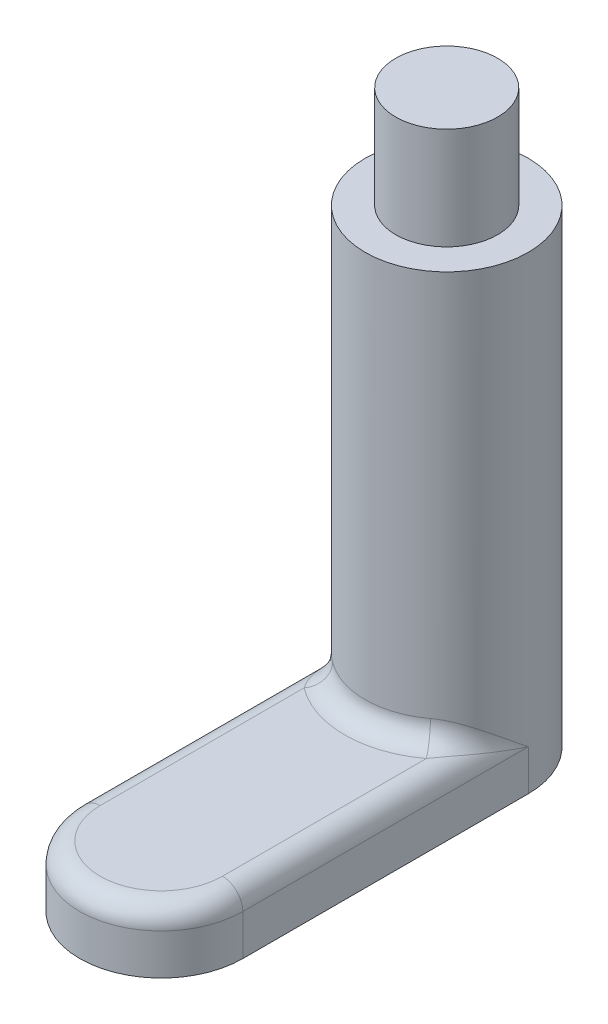
ISO-10303-21;
HEADER;
FILE_DESCRIPTION(('STEP AP214'),'2;1');
FILE_NAME('part.step','',(''),(''),'','','');
FILE_SCHEMA(('AUTOMOTIVE_DESIGN { 1 0 10303 214 1 1 1 1 }'));
ENDSEC;
DATA;
#1=APPLICATION_CONTEXT('core data for automotive mechanical design processes');
#2=APPLICATION_PROTOCOL_DEFINITION('international standard','automotive_design',2000,#1);
#3=PRODUCT_CONTEXT('',#1,'mechanical');
#4=PRODUCT('Part','Part','',(#3));
#5=PRODUCT_RELATED_PRODUCT_CATEGORY('part','',(#4));
#6=PRODUCT_DEFINITION_FORMATION('','',#4);
#7=PRODUCT_DEFINITION_CONTEXT('part definition',#1,'design');
#8=PRODUCT_DEFINITION('design','',#6,#7);
#9=PRODUCT_DEFINITION_SHAPE('','',#8);
#10=(LENGTH_UNIT() NAMED_UNIT(*) SI_UNIT(.MILLI.,.METRE.));
#11=(NAMED_UNIT(*) PLANE_ANGLE_UNIT() SI_UNIT($,.RADIAN.));
#12=(NAMED_UNIT(*) SI_UNIT($,.STERADIAN.) SOLID_ANGLE_UNIT());
#13=UNCERTAINTY_MEASURE_WITH_UNIT(LENGTH_MEASURE(1.E-05),#10,'distance_accuracy_value','');
#14=(GEOMETRIC_REPRESENTATION_CONTEXT(3) GLOBAL_UNCERTAINTY_ASSIGNED_CONTEXT((#13)) GLOBAL_UNIT_ASSIGNED_CONTEXT((#10,
#11,#12)) REPRESENTATION_CONTEXT('',''));
#15=CARTESIAN_POINT('',(0.,0.,0.));
#16=DIRECTION('',(0.,0.,1.));
#17=DIRECTION('',(1.,0.,0.));
#18=AXIS2_PLACEMENT_3D('',#15,#16,#17);
#19=CARTESIAN_POINT('',(0.,7.62,0.));
#20=DIRECTION('',(0.,-1.,0.));
#21=DIRECTION('',(0.,0.,-1.));
#22=AXIS2_PLACEMENT_3D('',#19,#20,#21);
#23=CYLINDRICAL_SURFACE('',#22,10.16);
#24=DIRECTION('',(0.,-1.,0.));
#25=VECTOR('',#24,1.);
#26=CARTESIAN_POINT('',(10.16,7.62,0.));
#27=LINE('',#26,#25);
#28=CARTESIAN_POINT('',(10.16,5.08,0.));
#29=VERTEX_POINT('',#28);
#30=CARTESIAN_POINT('',(10.16,0.,0.));
#31=VERTEX_POINT('',#30);
#32=EDGE_CURVE('E116',#29,#31,#27,.T.);
#33=ORIENTED_EDGE('',*,*,#32,.F.);
#34=CARTESIAN_POINT('',(0.,5.08,0.));
#35=DIRECTION('',(0.,1.,0.));
#36=DIRECTION('',(0.,0.,1.));
#37=AXIS2_PLACEMENT_3D('',#34,#35,#36);
#38=CIRCLE('',#37,10.16);
#39=CARTESIAN_POINT('',(-10.16,5.08,0.));
#40=VERTEX_POINT('',#39);
#41=EDGE_CURVE('E162',#29,#40,#38,.F.);
#42=ORIENTED_EDGE('',*,*,#41,.T.);
#43=DIRECTION('',(0.,-1.,0.));
#44=VECTOR('',#43,1.);
#45=CARTESIAN_POINT('',(-10.16,7.62,0.));
#46=LINE('',#45,#44);
#47=CARTESIAN_POINT('',(-10.16,0.,0.));
#48=VERTEX_POINT('',#47);
#49=EDGE_CURVE('E138',#40,#48,#46,.T.);
#50=ORIENTED_EDGE('',*,*,#49,.T.);
#51=CARTESIAN_POINT('',(0.,0.,0.));
#52=DIRECTION('',(0.,1.,0.));
#53=DIRECTION('',(0.,0.,1.));
#54=AXIS2_PLACEMENT_3D('',#51,#52,#53);
#55=CIRCLE('',#54,10.16);
#56=EDGE_CURVE('E133',#48,#31,#55,.T.);
#57=ORIENTED_EDGE('',*,*,#56,.T.);
#58=EDGE_LOOP('',(#33,#42,#50,#57));
#59=FACE_BOUND('',#58,.T.);
#60=ADVANCED_FACE('F50',(#59),#23,.T.);
#61=CARTESIAN_POINT('',(10.16,7.62,0.));
#62=DIRECTION('',(-1.,0.,0.));
#63=DIRECTION('',(0.,0.,1.));
#64=AXIS2_PLACEMENT_3D('',#61,#62,#63);
#65=PLANE('',#64);
#66=DIRECTION('',(0.,-1.,0.));
#67=VECTOR('',#66,1.);
#68=CARTESIAN_POINT('',(10.16,7.62,-35.56));
#69=LINE('',#68,#67);
#70=CARTESIAN_POINT('',(10.16,5.08,-35.56));
#71=VERTEX_POINT('',#70);
#72=CARTESIAN_POINT('',(10.16,0.,-35.56));
#73=VERTEX_POINT('',#72);
#74=EDGE_CURVE('E127',#71,#73,#69,.T.);
#75=ORIENTED_EDGE('',*,*,#74,.F.);
#76=DIRECTION('',(0.,0.,-1.));
#77=VECTOR('',#76,1.);
#78=CARTESIAN_POINT('',(10.16,5.08,0.));
#79=LINE('',#78,#77);
#80=EDGE_CURVE('E123',#71,#29,#79,.F.);
#81=ORIENTED_EDGE('',*,*,#80,.T.);
#82=ORIENTED_EDGE('',*,*,#32,.T.);
#83=DIRECTION('',(0.,0.,-1.));
#84=VECTOR('',#83,1.);
#85=CARTESIAN_POINT('',(10.16,0.,0.));
#86=LINE('',#85,#84);
#87=EDGE_CURVE('E120',#31,#73,#86,.T.);
#88=ORIENTED_EDGE('',*,*,#87,.T.);
#89=EDGE_LOOP('',(#75,#81,#82,#88));
#90=FACE_BOUND('',#89,.T.);
#91=ADVANCED_FACE('F119',(#90),#65,.F.);
#92=CARTESIAN_POINT('',(0.,7.62,-35.56));
#93=DIRECTION('',(0.,-1.,0.));
#94=DIRECTION('',(0.,0.,-1.));
#95=AXIS2_PLACEMENT_3D('',#92,#93,#94);
#96=CYLINDRICAL_SURFACE('',#95,10.16);
#97=CARTESIAN_POINT('',(0.,0.,-35.56));
#98=DIRECTION('',(0.,1.,0.));
#99=DIRECTION('',(0.,0.,1.));
#100=AXIS2_PLACEMENT_3D('',#97,#98,#99);
#101=CIRCLE('',#100,10.16);
#102=CARTESIAN_POINT('',(-10.16,0.,-35.56));
#103=VERTEX_POINT('',#102);
#104=EDGE_CURVE('E135',#73,#103,#101,.T.);
#105=ORIENTED_EDGE('',*,*,#104,.T.);
#106=DIRECTION('',(0.,-1.,0.));
#107=VECTOR('',#106,1.);
#108=CARTESIAN_POINT('',(-10.16,7.62,-35.56));
#109=LINE('',#108,#107);
#110=CARTESIAN_POINT('',(-10.16,5.08,-35.56));
#111=VERTEX_POINT('',#110);
#112=EDGE_CURVE('E150',#111,#103,#109,.T.);
#113=ORIENTED_EDGE('',*,*,#112,.F.);
#114=CARTESIAN_POINT('',(-6.80566249032221,7.48592070117279,-24.3620526445109));
#115=CARTESIAN_POINT('',(-5.53898139378088,7.05718423898991,-27.0007382562722));
#116=CARTESIAN_POINT('',(-4.79305998451554,9.89184140234559,-26.6016421156087));
#117=CARTESIAN_POINT('',(-6.87498703236082,7.50939373509454,-24.4361998027662));
#118=CARTESIAN_POINT('',(-5.56798611340166,7.10742633204501,-27.0281231781235));
#119=CARTESIAN_POINT('',(-4.90397925161336,9.938787471035,-26.6609598422189));
#120=CARTESIAN_POINT('',(-6.94444634537773,7.52955671140373,-24.513871817848));
#121=CARTESIAN_POINT('',(-5.6014858513196,7.15826854414265,-27.0569986342163));
#122=CARTESIAN_POINT('',(-5.01511415242699,9.97911342370522,-26.7230974542849));
#123=CARTESIAN_POINT('',(-7.08290304546941,7.56358412774397,-24.6757042073797));
#124=CARTESIAN_POINT('',(-5.6775552430657,7.25877239705613,-27.1188281834127));
#125=CARTESIAN_POINT('',(-5.2366448726422,10.0471682560147,-26.8525633659078));
#126=CARTESIAN_POINT('',(-7.15190089807617,7.57745633713468,-24.7598564273378));
#127=CARTESIAN_POINT('',(-5.71993504623946,7.30836382111652,-27.1516731529756));
#128=CARTESIAN_POINT('',(-5.34704143689487,10.0749126743739,-26.9198851418713));
#129=CARTESIAN_POINT('',(-7.28829679763213,7.59918761460054,-24.9335336112412));
#130=CARTESIAN_POINT('',(-5.81344052416578,7.40428300372671,-27.2223340074237));
#131=CARTESIAN_POINT('',(-5.56527487623818,10.1183752290974,-27.0588268889919));
#132=CARTESIAN_POINT('',(-7.3557034525924,7.60709672129527,-25.0230069102403));
#133=CARTESIAN_POINT('',(-5.8642962427977,7.45060211834669,-27.2599818110187));
#134=CARTESIAN_POINT('',(-5.67312552414748,10.1341934426956,-27.1304055281921));
#135=CARTESIAN_POINT('',(-7.48905176092228,7.61750410795693,-25.2074826017848));
#136=CARTESIAN_POINT('',(-5.9742154956817,7.53880149947137,-27.3412914572741));
#137=CARTESIAN_POINT('',(-5.88648281745849,10.1550082160863,-27.2779860814283));
#138=CARTESIAN_POINT('',(-7.55499278683412,7.62000011303243,-25.3024873017218));
#139=CARTESIAN_POINT('',(-6.03310547404325,7.58069842758274,-27.3848257295378));
#140=CARTESIAN_POINT('',(-5.9919884589278,10.160000226096,-27.3539898413776));
#141=CARTESIAN_POINT('',(-7.70611609318739,7.61999985026413,-25.5291766282989));
#142=CARTESIAN_POINT('',(-6.17784522510316,7.67114349766481,-27.4933883120403));
#143=CARTESIAN_POINT('',(-6.23378574910884,10.159999700487,-27.5353413026389));
#144=CARTESIAN_POINT('',(-7.79059346416884,7.61561933177688,-25.6627544736425));
#145=CARTESIAN_POINT('',(-6.26640370146366,7.7178502917263,-27.5608894569492));
#146=CARTESIAN_POINT('',(-6.36894954268194,10.1512386636648,-27.6422035789139));
#147=CARTESIAN_POINT('',(-7.9556207679695,7.59909600748358,-25.9375485717511));
#148=CARTESIAN_POINT('',(-6.45256635970107,7.79899854772922,-27.7078288152395));
#149=CARTESIAN_POINT('',(-6.63299322876124,10.1181920151299,-27.8620388574011));
#150=CARTESIAN_POINT('',(-8.03616780843514,7.5869475752541,-26.0787702931744));
#151=CARTESIAN_POINT('',(-6.54992888692934,7.83365294001639,-27.7869820904585));
#152=CARTESIAN_POINT('',(-6.76186849350171,10.0938951505702,-27.9750162345399));
#153=CARTESIAN_POINT('',(-8.27176465440937,7.5401831650559,-26.5132813769273));
#154=CARTESIAN_POINT('',(-6.84802457518154,7.91677575066634,-28.0401139055899));
#155=CARTESIAN_POINT('',(-7.13882344704397,10.0003663299875,-28.322625101541));
#156=CARTESIAN_POINT('',(-8.42025377892333,7.4952593505888,-26.8166384335035));
#157=CARTESIAN_POINT('',(-7.05960301503998,7.94737469561183,-28.2331104939828));
#158=CARTESIAN_POINT('',(-7.37640604625154,9.91051870108516,-28.5653107467985));
#159=CARTESIAN_POINT('',(-8.65744855645441,7.40089130971313,-27.3510205260054));
#160=CARTESIAN_POINT('',(-7.42158798955174,7.95388466607148,-28.5992022194642));
#161=CARTESIAN_POINT('',(-7.75591769034535,9.72178261949184,-28.9928164208074));
#162=CARTESIAN_POINT('',(-8.75098451612624,7.35655804461932,-27.5774350619691));
#163=CARTESIAN_POINT('',(-7.57067503759864,7.943949828798,-28.759860252423));
#164=CARTESIAN_POINT('',(-7.90557522585898,9.63311608940029,-29.1739480495854));
#165=CARTESIAN_POINT('',(-8.92846888741642,7.25938933891704,-28.0380627279493));
#166=CARTESIAN_POINT('',(-7.86233105386745,7.90039167689388,-29.0978644411628));
#167=CARTESIAN_POINT('',(-8.18955021991727,9.43877867797442,-29.5424501823681));
#168=CARTESIAN_POINT('',(-9.01241347146627,7.20655052417494,-28.272278923503));
#169=CARTESIAN_POINT('',(-8.00527543021146,7.86730256833212,-29.2750654408433));
#170=CARTESIAN_POINT('',(-8.32386155435231,9.33310104837274,-29.7298231388026));
#171=CARTESIAN_POINT('',(-9.170858182391,7.09392674208571,-28.7470413730406));
#172=CARTESIAN_POINT('',(-8.28077542656089,7.78059879495437,-29.6431827314981));
#173=CARTESIAN_POINT('',(-8.5773730918193,9.10785348414853,-30.1096330984323));
#174=CARTESIAN_POINT('',(-9.24534815625577,7.03413443740688,-28.9875941025502));
#175=CARTESIAN_POINT('',(-8.41380810635905,7.72733093820304,-29.834160122401));
#176=CARTESIAN_POINT('',(-8.69655705003517,8.98826887486284,-30.302075282048));
#177=CARTESIAN_POINT('',(-9.38504723797355,6.9089356214062,-29.4736234500566));
#178=CARTESIAN_POINT('',(-8.66687716701654,7.60357486409889,-30.2269663757333));
#179=CARTESIAN_POINT('',(-8.92007558078376,8.73787124287133,-30.690898760052));
#180=CARTESIAN_POINT('',(-9.45025374833556,6.84352754697955,-29.7191014242911));
#181=CARTESIAN_POINT('',(-8.78742066959681,7.53328923631548,-30.4289894457659));
#182=CARTESIAN_POINT('',(-9.02440599733088,8.60705509395588,-30.8872811394304));
#183=CARTESIAN_POINT('',(-9.59693916545493,6.67997096666947,-30.3171150072607));
#184=CARTESIAN_POINT('',(-9.06020500790309,7.34690780414291,-30.9258516552915));
#185=CARTESIAN_POINT('',(-9.25910266473639,8.2799419333435,-31.3656920058121));
#186=CARTESIAN_POINT('',(-9.67387367297341,6.57953846442986,-30.6716300393596));
#187=CARTESIAN_POINT('',(-9.20726170680295,7.22315770200732,-31.2275105115453));
#188=CARTESIAN_POINT('',(-9.38219787685095,8.07907692900003,-31.6493040315184));
#189=CARTESIAN_POINT('',(-9.81035003601109,6.37204981305093,-31.3863181408447));
#190=CARTESIAN_POINT('',(-9.46956685067925,6.95471574940231,-31.8424777133163));
#191=CARTESIAN_POINT('',(-9.60056005772133,7.66409962626129,-32.221054512709));
#192=CARTESIAN_POINT('',(-9.86988401221932,6.26499068975101,-31.7464936958812));
#193=CARTESIAN_POINT('',(-9.58597903552923,6.80981532279238,-32.156930977301));
#194=CARTESIAN_POINT('',(-9.69581441957953,7.4499813795447,-32.5091949567136));
#195=CARTESIAN_POINT('',(-9.97208282920137,6.04635800728952,-32.4703109321634));
#196=CARTESIAN_POINT('',(-9.78614253908064,6.50569990885748,-32.7929452922724));
#197=CARTESIAN_POINT('',(-9.8593325266936,7.01271601453641,-33.0882487457221));
#198=CARTESIAN_POINT('',(-10.0147658978905,5.93478947090243,-32.8339484299263));
#199=CARTESIAN_POINT('',(-9.8708255896592,6.34603530971937,-33.1157915572175));
#200=CARTESIAN_POINT('',(-9.92762543661386,6.78957894179349,-33.3791587439396));
#201=CARTESIAN_POINT('',(-10.0837924377274,5.70872355522918,-33.5635175630361));
#202=CARTESIAN_POINT('',(-10.007627514579,6.01775763563483,-33.7654941276914));
#203=CARTESIAN_POINT('',(-10.0380679003647,6.33744711046982,-33.9628140504322));
#204=CARTESIAN_POINT('',(-10.1101411047527,5.59422711937003,-33.9294484314243));
#205=CARTESIAN_POINT('',(-10.0603658543119,5.84851114419128,-34.0937382407385));
#206=CARTESIAN_POINT('',(-10.0802257675994,6.10845423874308,-34.2555587451403));
#207=CARTESIAN_POINT('',(-10.149199153985,5.34862260145683,-34.7105099184032));
#208=CARTESIAN_POINT('',(-10.1382491685824,5.48346544788867,-34.7944107123959));
#209=CARTESIAN_POINT('',(-10.1427186463816,5.61724520291025,-34.8804079347215));
#210=CARTESIAN_POINT('',(-10.1596816247622,5.21729547784354,-35.1258331346048));
#211=CARTESIAN_POINT('',(-10.1593614367689,5.28595120729109,-35.1692340630975));
#212=CARTESIAN_POINT('',(-10.1594905996444,5.35459095568712,-35.2126665076837));
#213=CARTESIAN_POINT('',(-10.1599976177526,5.08401582634567,-35.547300841625));
#214=CARTESIAN_POINT('',(-10.1599952628227,5.08602374251918,-35.5485707532873));
#215=CARTESIAN_POINT('',(-10.1599961884048,5.08803165269135,-35.5498406733));
#216=CARTESIAN_POINT('',(-10.1599999986226,5.08200790478933,-35.5536504467654));
#217=CARTESIAN_POINT('',(-10.1600000253891,5.08301185823001,-35.554285401658));
#218=CARTESIAN_POINT('',(-10.1599999977965,5.08401580957867,-35.5549203574123));
#219=CARTESIAN_POINT('',(-10.16,5.08,-35.56));
#220=CARTESIAN_POINT('',(-10.16,5.08,-35.56));
#221=CARTESIAN_POINT('',(-10.16,5.08,-35.56));
#222=(BOUNDED_SURFACE() B_SPLINE_SURFACE(3,2,((#114,#115,#116),(#117,#118,#119),(#120,#121,
#122),(#123,#124,#125),(#126,#127,#128),(#129,#130,#131),(#132,#133,#134),(#135,#136,#137),
(#138,#139,#140),(#141,#142,#143),(#144,#145,#146),(#147,#148,#149),(#150,#151,#152),(#153,#154,
#155),(#156,#157,#158),(#159,#160,#161),(#162,#163,#164),(#165,#166,#167),(#168,#169,#170),
(#171,#172,#173),(#174,#175,#176),(#177,#178,#179),(#180,#181,#182),(#183,#184,#185),(#186,#187,
#188),(#189,#190,#191),(#192,#193,#194),(#195,#196,#197),(#198,#199,#200),(#201,#202,#203),
(#204,#205,#206),(#207,#208,#209),(#210,#211,#212),(#213,#214,#215),(#216,#217,#218),(#219,#220,
#221)),.UNSPECIFIED.,.F.,.F.,.F.) B_SPLINE_SURFACE_WITH_KNOTS((4,2,2,2,2,2,2,2,2,2,2,2,2,2,2,2,
2,4),(3,3),(0.,0.491991316891406,0.983373337959708,1.47058463470566,1.95800064554514,
2.60368841719899,3.24984440136862,4.54598871415859,5.46532172201146,6.38502033018898,
7.3056983649325,8.22663349905485,9.53138811046873,10.8367326289402,12.140661239415,
13.4441748647227,14.9176864780284,14.9402253378962),(0.,1.),
.UNSPECIFIED.) GEOMETRIC_REPRESENTATION_ITEM() RATIONAL_B_SPLINE_SURFACE(((1.,0.651441446680811,
1.),(1.,0.655035255066732,1.),(1.,0.658957701492741,1.),(1.,0.667365544942095,1.),(1.,
0.671850238775785,1.),(1.,0.681257501454882,1.),(1.,0.686176030644377,1.),(1.,0.696386037113998,
1.),(1.,0.701677670229303,1.),(1.,0.714298811152912,1.),(1.,0.72173209718842,1.),(1.,
0.736870665516967,1.),(1.,0.74457614113613,1.),(1.,0.76786822546454,1.),(1.,0.783585561318517,
1.),(1.,0.809764036450357,1.),(1.,0.820424868835806,1.),(1.,0.841119029006637,1.),(1.,
0.851152105560004,1.),(1.,0.870419806017391,1.),(1.,0.879653568236328,1.),(1.,0.897203129250384,
1.),(1.,0.905518670984124,1.),(1.,0.924416961273995,1.),(1.,0.934500220234443,1.),(1.,
0.952558371523122,1.),(1.,0.960532308553211,1.),(1.,0.974306485073167,1.),(1.,0.980109072992145,
1.),(1.,0.98952685046428,1.),(1.,0.99314273558582,1.),(1.,0.998509708534984,1.),(1.,
0.999956099031262,1.),(1.,0.999999672202361,1.),(1.,1.00000000028904,1.),(1.,1.,1.))) REPRESENTATION_ITEM('') SURFACE());
#223=CARTESIAN_POINT('',(-4.79305998451554,9.89184140234559,-26.6016421156087));
#224=CARTESIAN_POINT('',(-4.90397925161336,9.938787471035,-26.6609598422189));
#225=CARTESIAN_POINT('',(-5.01511415242699,9.97911342370522,-26.7230974542849));
#226=CARTESIAN_POINT('',(-5.2366448726422,10.0471682560147,-26.8525633659078));
#227=CARTESIAN_POINT('',(-5.34704143689487,10.0749126743739,-26.9198851418713));
#228=CARTESIAN_POINT('',(-5.56527487623818,10.1183752290974,-27.0588268889919));
#229=CARTESIAN_POINT('',(-5.67312552414748,10.1341934426956,-27.1304055281921));
#230=CARTESIAN_POINT('',(-5.88648281745849,10.1550082160863,-27.2779860814283));
#231=CARTESIAN_POINT('',(-5.9919884589278,10.160000226096,-27.3539898413776));
#232=CARTESIAN_POINT('',(-6.23378574910884,10.159999700487,-27.535341302639));
#233=CARTESIAN_POINT('',(-6.36894954268194,10.1512386636648,-27.6422035789139));
#234=CARTESIAN_POINT('',(-6.63299322876124,10.1181920151299,-27.8620388574011));
#235=CARTESIAN_POINT('',(-6.76186849350171,10.0938951505702,-27.9750162345399));
#236=CARTESIAN_POINT('',(-7.13882344704397,10.0003663299875,-28.322625101541));
#237=CARTESIAN_POINT('',(-7.37640604625154,9.91051870108516,-28.5653107467985));
#238=CARTESIAN_POINT('',(-7.75591769034535,9.72178261949184,-28.9928164208074));
#239=CARTESIAN_POINT('',(-7.90557522585898,9.63311608940029,-29.1739480495854));
#240=CARTESIAN_POINT('',(-8.18955021991727,9.43877867797442,-29.5424501823681));
#241=CARTESIAN_POINT('',(-8.32386155435231,9.33310104837273,-29.7298231388026));
#242=CARTESIAN_POINT('',(-8.5773730918193,9.10785348414854,-30.1096330984323));
#243=CARTESIAN_POINT('',(-8.69655705003517,8.98826887486284,-30.302075282048));
#244=CARTESIAN_POINT('',(-8.92007558078376,8.73787124287133,-30.690898760052));
#245=CARTESIAN_POINT('',(-9.02440599733088,8.60705509395588,-30.8872811394304));
#246=CARTESIAN_POINT('',(-9.25910266473639,8.2799419333435,-31.3656920058121));
#247=CARTESIAN_POINT('',(-9.38219787685095,8.07907692900003,-31.6493040315184));
#248=CARTESIAN_POINT('',(-9.60056005772133,7.66409962626129,-32.221054512709));
#249=CARTESIAN_POINT('',(-9.69581441957953,7.4499813795447,-32.5091949567136));
#250=CARTESIAN_POINT('',(-9.8593325266936,7.01271601453641,-33.0882487457221));
#251=CARTESIAN_POINT('',(-9.92762543661386,6.78957894179349,-33.3791587439396));
#252=CARTESIAN_POINT('',(-10.0380679003647,6.33744711046982,-33.9628140504322));
#253=CARTESIAN_POINT('',(-10.0802257675994,6.10845423874308,-34.2555587451403));
#254=CARTESIAN_POINT('',(-10.1427186463816,5.61724520291024,-34.8804079347216));
#255=CARTESIAN_POINT('',(-10.1594905996444,5.35459095568711,-35.2126665076838));
#256=CARTESIAN_POINT('',(-10.1599961884048,5.08803165269136,-35.5498406733));
#257=CARTESIAN_POINT('',(-10.1599999977965,5.08401580957867,-35.5549203574123));
#258=CARTESIAN_POINT('',(-10.16,5.08,-35.56));
#259=B_SPLINE_CURVE_WITH_KNOTS('',3,(#223,#224,#225,#226,#227,#228,#229,#230,#231,#232,#233,
#234,#235,#236,#237,#238,#239,#240,#241,#242,#243,#244,#245,#246,#247,#248,#249,#250,#251,#252,
#253,#254,#255,#256,#257,#258),.UNSPECIFIED.,.F.,.F.,(4,2,2,2,2,2,2,2,2,2,2,2,2,2,2,2,2,4),(0.,
0.491991316891406,0.983373337959708,1.47058463470566,1.95800064554514,2.60368841719899,
3.24984440136862,4.54598871415859,5.46532172201146,6.38502033018898,7.3056983649325,
8.22663349905485,9.53138811046873,10.8367326289402,12.140661239415,13.4441748647227,
14.9176864780284,14.9402253378962),.UNSPECIFIED.);
#260=CARTESIAN_POINT('',(-6.09599999999997,10.16,-27.432));
#261=VERTEX_POINT('',#260);
#262=EDGE_CURVE('E76',#111,#261,#259,.F.);
#263=ORIENTED_EDGE('',*,*,#262,.T.);
#264=CARTESIAN_POINT('',(0.,10.16,-35.56));
#265=DIRECTION('',(0.,1.,0.));
#266=DIRECTION('',(0.,0.,1.));
#267=AXIS2_PLACEMENT_3D('',#264,#265,#266);
#268=CIRCLE('',#267,10.16);
#269=CARTESIAN_POINT('',(6.09599999999997,10.16,-27.432));
#270=VERTEX_POINT('',#269);
#271=EDGE_CURVE('E71',#261,#270,#268,.T.);
#272=ORIENTED_EDGE('',*,*,#271,.T.);
#273=CARTESIAN_POINT('',(4.79305998451554,9.89184140234559,-26.6016421156087));
#274=CARTESIAN_POINT('',(5.53898139378088,7.05718423898991,-27.0007382562722));
#275=CARTESIAN_POINT('',(6.80566249032221,7.48592070117279,-24.3620526445109));
#276=CARTESIAN_POINT('',(4.90397925161336,9.938787471035,-26.6609598422189));
#277=CARTESIAN_POINT('',(5.56798611340166,7.10742633204501,-27.0281231781235));
#278=CARTESIAN_POINT('',(6.87498703236082,7.50939373509454,-24.4361998027662));
#279=CARTESIAN_POINT('',(5.01511415242699,9.97911342370522,-26.7230974542849));
#280=CARTESIAN_POINT('',(5.6014858513196,7.15826854414265,-27.0569986342163));
#281=CARTESIAN_POINT('',(6.94444634537773,7.52955671140373,-24.513871817848));
#282=CARTESIAN_POINT('',(5.2366448726422,10.0471682560147,-26.8525633659078));
#283=CARTESIAN_POINT('',(5.6775552430657,7.25877239705613,-27.1188281834127));
#284=CARTESIAN_POINT('',(7.08290304546941,7.56358412774397,-24.6757042073797));
#285=CARTESIAN_POINT('',(5.34704143689487,10.0749126743739,-26.9198851418713));
#286=CARTESIAN_POINT('',(5.71993504623946,7.30836382111652,-27.1516731529756));
#287=CARTESIAN_POINT('',(7.15190089807617,7.57745633713468,-24.7598564273378));
#288=CARTESIAN_POINT('',(5.56527487623818,10.1183752290974,-27.0588268889919));
#289=CARTESIAN_POINT('',(5.81344052416578,7.40428300372671,-27.2223340074237));
#290=CARTESIAN_POINT('',(7.28829679763213,7.59918761460054,-24.9335336112412));
#291=CARTESIAN_POINT('',(5.67312552414748,10.1341934426956,-27.1304055281921));
#292=CARTESIAN_POINT('',(5.8642962427977,7.45060211834669,-27.2599818110187));
#293=CARTESIAN_POINT('',(7.3557034525924,7.60709672129527,-25.0230069102403));
#294=CARTESIAN_POINT('',(5.88648281745849,10.1550082160863,-27.2779860814283));
#295=CARTESIAN_POINT('',(5.9742154956817,7.53880149947137,-27.3412914572741));
#296=CARTESIAN_POINT('',(7.48905176092228,7.61750410795693,-25.2074826017848));
#297=CARTESIAN_POINT('',(5.9919884589278,10.160000226096,-27.3539898413776));
#298=CARTESIAN_POINT('',(6.03310547404325,7.58069842758274,-27.3848257295378));
#299=CARTESIAN_POINT('',(7.55499278683412,7.62000011303243,-25.3024873017218));
#300=CARTESIAN_POINT('',(6.23378574910884,10.159999700487,-27.5353413026389));
#301=CARTESIAN_POINT('',(6.17784522510316,7.67114349766481,-27.4933883120403));
#302=CARTESIAN_POINT('',(7.70611609318739,7.61999985026413,-25.5291766282989));
#303=CARTESIAN_POINT('',(6.36894954268194,10.1512386636648,-27.6422035789139));
#304=CARTESIAN_POINT('',(6.26640370146366,7.7178502917263,-27.5608894569492));
#305=CARTESIAN_POINT('',(7.79059346416884,7.61561933177688,-25.6627544736425));
#306=CARTESIAN_POINT('',(6.63299322876124,10.1181920151299,-27.8620388574011));
#307=CARTESIAN_POINT('',(6.45256635970107,7.79899854772922,-27.7078288152395));
#308=CARTESIAN_POINT('',(7.9556207679695,7.59909600748358,-25.9375485717511));
#309=CARTESIAN_POINT('',(6.76186849350171,10.0938951505702,-27.9750162345399));
#310=CARTESIAN_POINT('',(6.54992888692934,7.83365294001639,-27.7869820904585));
#311=CARTESIAN_POINT('',(8.03616780843514,7.5869475752541,-26.0787702931744));
#312=CARTESIAN_POINT('',(7.13882344704397,10.0003663299875,-28.322625101541));
#313=CARTESIAN_POINT('',(6.84802457518154,7.91677575066634,-28.0401139055899));
#314=CARTESIAN_POINT('',(8.27176465440937,7.5401831650559,-26.5132813769273));
#315=CARTESIAN_POINT('',(7.37640604625154,9.91051870108516,-28.5653107467985));
#316=CARTESIAN_POINT('',(7.05960301503998,7.94737469561183,-28.2331104939828));
#317=CARTESIAN_POINT('',(8.42025377892333,7.4952593505888,-26.8166384335035));
#318=CARTESIAN_POINT('',(7.75591769034535,9.72178261949184,-28.9928164208074));
#319=CARTESIAN_POINT('',(7.42158798955174,7.95388466607148,-28.5992022194642));
#320=CARTESIAN_POINT('',(8.65744855645441,7.40089130971313,-27.3510205260054));
#321=CARTESIAN_POINT('',(7.90557522585898,9.63311608940029,-29.1739480495854));
#322=CARTESIAN_POINT('',(7.57067503759864,7.943949828798,-28.759860252423));
#323=CARTESIAN_POINT('',(8.75098451612624,7.35655804461932,-27.5774350619691));
#324=CARTESIAN_POINT('',(8.18955021991727,9.43877867797442,-29.5424501823681));
#325=CARTESIAN_POINT('',(7.86233105386745,7.90039167689388,-29.0978644411628));
#326=CARTESIAN_POINT('',(8.92846888741642,7.25938933891704,-28.0380627279493));
#327=CARTESIAN_POINT('',(8.32386155435231,9.33310104837274,-29.7298231388026));
#328=CARTESIAN_POINT('',(8.00527543021146,7.86730256833212,-29.2750654408433));
#329=CARTESIAN_POINT('',(9.01241347146627,7.20655052417494,-28.272278923503));
#330=CARTESIAN_POINT('',(8.5773730918193,9.10785348414853,-30.1096330984323));
#331=CARTESIAN_POINT('',(8.28077542656089,7.78059879495437,-29.6431827314981));
#332=CARTESIAN_POINT('',(9.170858182391,7.09392674208571,-28.7470413730406));
#333=CARTESIAN_POINT('',(8.69655705003517,8.98826887486284,-30.302075282048));
#334=CARTESIAN_POINT('',(8.41380810635905,7.72733093820304,-29.834160122401));
#335=CARTESIAN_POINT('',(9.24534815625577,7.03413443740688,-28.9875941025502));
#336=CARTESIAN_POINT('',(8.92007558078376,8.73787124287133,-30.690898760052));
#337=CARTESIAN_POINT('',(8.66687716701654,7.60357486409889,-30.2269663757333));
#338=CARTESIAN_POINT('',(9.38504723797355,6.9089356214062,-29.4736234500566));
#339=CARTESIAN_POINT('',(9.02440599733088,8.60705509395588,-30.8872811394304));
#340=CARTESIAN_POINT('',(8.78742066959681,7.53328923631548,-30.4289894457659));
#341=CARTESIAN_POINT('',(9.45025374833556,6.84352754697955,-29.7191014242911));
#342=CARTESIAN_POINT('',(9.25910266473639,8.2799419333435,-31.3656920058121));
#343=CARTESIAN_POINT('',(9.06020500790309,7.34690780414291,-30.9258516552915));
#344=CARTESIAN_POINT('',(9.59693916545493,6.67997096666947,-30.3171150072607));
#345=CARTESIAN_POINT('',(9.38219787685095,8.07907692900003,-31.6493040315184));
#346=CARTESIAN_POINT('',(9.20726170680295,7.22315770200732,-31.2275105115453));
#347=CARTESIAN_POINT('',(9.67387367297341,6.57953846442986,-30.6716300393596));
#348=CARTESIAN_POINT('',(9.60056005772133,7.66409962626129,-32.221054512709));
#349=CARTESIAN_POINT('',(9.46956685067925,6.95471574940231,-31.8424777133163));
#350=CARTESIAN_POINT('',(9.81035003601109,6.37204981305093,-31.3863181408447));
#351=CARTESIAN_POINT('',(9.69581441957953,7.4499813795447,-32.5091949567136));
#352=CARTESIAN_POINT('',(9.58597903552923,6.80981532279238,-32.156930977301));
#353=CARTESIAN_POINT('',(9.86988401221932,6.26499068975101,-31.7464936958812));
#354=CARTESIAN_POINT('',(9.8593325266936,7.01271601453641,-33.0882487457221));
#355=CARTESIAN_POINT('',(9.78614253908064,6.50569990885748,-32.7929452922724));
#356=CARTESIAN_POINT('',(9.97208282920137,6.04635800728952,-32.4703109321634));
#357=CARTESIAN_POINT('',(9.92762543661386,6.78957894179349,-33.3791587439396));
#358=CARTESIAN_POINT('',(9.8708255896592,6.34603530971937,-33.1157915572175));
#359=CARTESIAN_POINT('',(10.0147658978905,5.93478947090243,-32.8339484299263));
#360=CARTESIAN_POINT('',(10.0380679003647,6.33744711046982,-33.9628140504322));
#361=CARTESIAN_POINT('',(10.007627514579,6.01775763563483,-33.7654941276914));
#362=CARTESIAN_POINT('',(10.0837924377274,5.70872355522918,-33.5635175630361));
#363=CARTESIAN_POINT('',(10.0802257675994,6.10845423874308,-34.2555587451403));
#364=CARTESIAN_POINT('',(10.0603658543119,5.84851114419128,-34.0937382407385));
#365=CARTESIAN_POINT('',(10.1101411047527,5.59422711937003,-33.9294484314243));
#366=CARTESIAN_POINT('',(10.1427186463816,5.61724520291025,-34.8804079347215));
#367=CARTESIAN_POINT('',(10.1382491685824,5.48346544788867,-34.7944107123959));
#368=CARTESIAN_POINT('',(10.149199153985,5.34862260145683,-34.7105099184032));
#369=CARTESIAN_POINT('',(10.1594905996444,5.35459095568712,-35.2126665076837));
#370=CARTESIAN_POINT('',(10.1593614367689,5.28595120729109,-35.1692340630975));
#371=CARTESIAN_POINT('',(10.1596816247622,5.21729547784354,-35.1258331346048));
#372=CARTESIAN_POINT('',(10.1599961884048,5.08803165269135,-35.5498406733));
#373=CARTESIAN_POINT('',(10.1599952628227,5.08602374251918,-35.5485707532873));
#374=CARTESIAN_POINT('',(10.1599976177526,5.08401582634567,-35.547300841625));
#375=CARTESIAN_POINT('',(10.1599999977965,5.08401580957867,-35.5549203574123));
#376=CARTESIAN_POINT('',(10.1600000253891,5.08301185823001,-35.554285401658));
#377=CARTESIAN_POINT('',(10.1599999986226,5.08200790478933,-35.5536504467654));
#378=CARTESIAN_POINT('',(10.16,5.08,-35.56));
#379=CARTESIAN_POINT('',(10.16,5.08,-35.56));
#380=CARTESIAN_POINT('',(10.16,5.08,-35.56));
#381=(BOUNDED_SURFACE() B_SPLINE_SURFACE(3,2,((#273,#274,#275),(#276,#277,#278),(#279,#280,
#281),(#282,#283,#284),(#285,#286,#287),(#288,#289,#290),(#291,#292,#293),(#294,#295,#296),
(#297,#298,#299),(#300,#301,#302),(#303,#304,#305),(#306,#307,#308),(#309,#310,#311),(#312,#313,
#314),(#315,#316,#317),(#318,#319,#320),(#321,#322,#323),(#324,#325,#326),(#327,#328,#329),
(#330,#331,#332),(#333,#334,#335),(#336,#337,#338),(#339,#340,#341),(#342,#343,#344),(#345,#346,
#347),(#348,#349,#350),(#351,#352,#353),(#354,#355,#356),(#357,#358,#359),(#360,#361,#362),
(#363,#364,#365),(#366,#367,#368),(#369,#370,#371),(#372,#373,#374),(#375,#376,#377),(#378,#379,
#380)),.UNSPECIFIED.,.F.,.F.,.F.) B_SPLINE_SURFACE_WITH_KNOTS((4,2,2,2,2,2,2,2,2,2,2,2,2,2,2,2,
2,4),(3,3),(0.,0.491991316891406,0.983373337959708,1.47058463470566,1.95800064554514,
2.60368841719899,3.24984440136862,4.54598871415859,5.46532172201146,6.38502033018898,
7.3056983649325,8.22663349905485,9.53138811046873,10.8367326289402,12.140661239415,
13.4441748647227,14.9176864780284,14.9402253378962),(0.,1.),
.UNSPECIFIED.) GEOMETRIC_REPRESENTATION_ITEM() RATIONAL_B_SPLINE_SURFACE(((1.,0.651441446680811,
1.),(1.,0.655035255066732,1.),(1.,0.658957701492741,1.),(1.,0.667365544942095,1.),(1.,
0.671850238775785,1.),(1.,0.681257501454882,1.),(1.,0.686176030644377,1.),(1.,0.696386037113998,
1.),(1.,0.701677670229303,1.),(1.,0.714298811152912,1.),(1.,0.72173209718842,1.),(1.,
0.736870665516967,1.),(1.,0.74457614113613,1.),(1.,0.76786822546454,1.),(1.,0.783585561318517,
1.),(1.,0.809764036450357,1.),(1.,0.820424868835806,1.),(1.,0.841119029006637,1.),(1.,
0.851152105560004,1.),(1.,0.870419806017391,1.),(1.,0.879653568236328,1.),(1.,0.897203129250384,
1.),(1.,0.905518670984124,1.),(1.,0.924416961273995,1.),(1.,0.934500220234443,1.),(1.,
0.952558371523122,1.),(1.,0.960532308553211,1.),(1.,0.974306485073167,1.),(1.,0.980109072992145,
1.),(1.,0.98952685046428,1.),(1.,0.99314273558582,1.),(1.,0.998509708534984,1.),(1.,
0.999956099031262,1.),(1.,0.999999672202361,1.),(1.,1.00000000028904,1.),(1.,1.,1.))) REPRESENTATION_ITEM('') SURFACE());
#382=CARTESIAN_POINT('',(4.79305998451554,9.89184140234559,-26.6016421156087));
#383=CARTESIAN_POINT('',(4.90397925161336,9.938787471035,-26.6609598422189));
#384=CARTESIAN_POINT('',(5.01511415242699,9.97911342370522,-26.7230974542849));
#385=CARTESIAN_POINT('',(5.2366448726422,10.0471682560147,-26.8525633659078));
#386=CARTESIAN_POINT('',(5.34704143689487,10.0749126743739,-26.9198851418713));
#387=CARTESIAN_POINT('',(5.56527487623818,10.1183752290974,-27.0588268889919));
#388=CARTESIAN_POINT('',(5.67312552414748,10.1341934426956,-27.1304055281921));
#389=CARTESIAN_POINT('',(5.88648281745849,10.1550082160863,-27.2779860814283));
#390=CARTESIAN_POINT('',(5.9919884589278,10.160000226096,-27.3539898413776));
#391=CARTESIAN_POINT('',(6.23378574910884,10.159999700487,-27.535341302639));
#392=CARTESIAN_POINT('',(6.36894954268194,10.1512386636648,-27.6422035789139));
#393=CARTESIAN_POINT('',(6.63299322876124,10.1181920151299,-27.8620388574011));
#394=CARTESIAN_POINT('',(6.76186849350171,10.0938951505702,-27.9750162345399));
#395=CARTESIAN_POINT('',(7.13882344704397,10.0003663299875,-28.322625101541));
#396=CARTESIAN_POINT('',(7.37640604625154,9.91051870108516,-28.5653107467985));
#397=CARTESIAN_POINT('',(7.75591769034535,9.72178261949184,-28.9928164208074));
#398=CARTESIAN_POINT('',(7.90557522585898,9.63311608940029,-29.1739480495854));
#399=CARTESIAN_POINT('',(8.18955021991727,9.43877867797442,-29.5424501823681));
#400=CARTESIAN_POINT('',(8.32386155435231,9.33310104837273,-29.7298231388026));
#401=CARTESIAN_POINT('',(8.5773730918193,9.10785348414854,-30.1096330984323));
#402=CARTESIAN_POINT('',(8.69655705003517,8.98826887486284,-30.302075282048));
#403=CARTESIAN_POINT('',(8.92007558078376,8.73787124287133,-30.690898760052));
#404=CARTESIAN_POINT('',(9.02440599733088,8.60705509395588,-30.8872811394304));
#405=CARTESIAN_POINT('',(9.25910266473639,8.2799419333435,-31.3656920058121));
#406=CARTESIAN_POINT('',(9.38219787685095,8.07907692900003,-31.6493040315184));
#407=CARTESIAN_POINT('',(9.60056005772133,7.66409962626129,-32.221054512709));
#408=CARTESIAN_POINT('',(9.69581441957953,7.4499813795447,-32.5091949567136));
#409=CARTESIAN_POINT('',(9.8593325266936,7.01271601453641,-33.0882487457221));
#410=CARTESIAN_POINT('',(9.92762543661386,6.78957894179349,-33.3791587439396));
#411=CARTESIAN_POINT('',(10.0380679003647,6.33744711046982,-33.9628140504322));
#412=CARTESIAN_POINT('',(10.0802257675994,6.10845423874308,-34.2555587451403));
#413=CARTESIAN_POINT('',(10.1427186463816,5.61724520291024,-34.8804079347216));
#414=CARTESIAN_POINT('',(10.1594905996444,5.35459095568711,-35.2126665076838));
#415=CARTESIAN_POINT('',(10.1599961884048,5.08803165269136,-35.5498406733));
#416=CARTESIAN_POINT('',(10.1599999977965,5.08401580957867,-35.5549203574123));
#417=CARTESIAN_POINT('',(10.16,5.08,-35.56));
#418=B_SPLINE_CURVE_WITH_KNOTS('',3,(#382,#383,#384,#385,#386,#387,#388,#389,#390,#391,#392,
#393,#394,#395,#396,#397,#398,#399,#400,#401,#402,#403,#404,#405,#406,#407,#408,#409,#410,#411,
#412,#413,#414,#415,#416,#417),.UNSPECIFIED.,.F.,.F.,(4,2,2,2,2,2,2,2,2,2,2,2,2,2,2,2,2,4),(0.,
0.491991316891406,0.983373337959708,1.47058463470566,1.95800064554514,2.60368841719899,
3.24984440136862,4.54598871415859,5.46532172201146,6.38502033018898,7.3056983649325,
8.22663349905485,9.53138811046873,10.8367326289402,12.140661239415,13.4441748647227,
14.9176864780284,14.9402253378962),.UNSPECIFIED.);
#419=EDGE_CURVE('E63',#270,#71,#418,.T.);
#420=ORIENTED_EDGE('',*,*,#419,.T.);
#421=ORIENTED_EDGE('',*,*,#74,.T.);
#422=EDGE_LOOP('',(#105,#113,#263,#272,#420,#421));
#423=FACE_BOUND('',#422,.T.);
#424=CARTESIAN_POINT('',(0.,58.42,-35.56));
#425=DIRECTION('',(0.,1.,0.));
#426=DIRECTION('',(0.,0.,1.));
#427=AXIS2_PLACEMENT_3D('',#424,#425,#426);
#428=CIRCLE('',#427,10.16);
#429=CARTESIAN_POINT('',(0.,58.42,-25.4));
#430=VERTEX_POINT('',#429);
#431=EDGE_CURVE('E140',#430,#430,#428,.T.);
#432=ORIENTED_EDGE('',*,*,#431,.F.);
#433=EDGE_LOOP('',(#432));
#434=FACE_BOUND('',#433,.T.);
#435=ADVANCED_FACE('F183',(#423,#434),#96,.T.);
#436=CARTESIAN_POINT('',(-10.16,7.62,0.));
#437=DIRECTION('',(1.,0.,0.));
#438=DIRECTION('',(0.,0.,-1.));
#439=AXIS2_PLACEMENT_3D('',#436,#437,#438);
#440=PLANE('',#439);
#441=ORIENTED_EDGE('',*,*,#49,.F.);
#442=DIRECTION('',(0.,0.,1.));
#443=VECTOR('',#442,1.);
#444=CARTESIAN_POINT('',(-10.16,5.08,-35.56));
#445=LINE('',#444,#443);
#446=EDGE_CURVE('E164',#40,#111,#445,.F.);
#447=ORIENTED_EDGE('',*,*,#446,.T.);
#448=ORIENTED_EDGE('',*,*,#112,.T.);
#449=DIRECTION('',(0.,0.,1.));
#450=VECTOR('',#449,1.);
#451=CARTESIAN_POINT('',(-10.16,0.,0.));
#452=LINE('',#451,#450);
#453=EDGE_CURVE('E147',#103,#48,#452,.T.);
#454=ORIENTED_EDGE('',*,*,#453,.T.);
#455=EDGE_LOOP('',(#441,#447,#448,#454));
#456=FACE_BOUND('',#455,.T.);
#457=ADVANCED_FACE('F188',(#456),#440,.F.);
#458=CARTESIAN_POINT('',(0.,7.62,0.));
#459=DIRECTION('',(0.,1.,0.));
#460=DIRECTION('',(0.,0.,1.));
#461=AXIS2_PLACEMENT_3D('',#458,#459,#460);
#462=PLANE('',#461);
#463=CARTESIAN_POINT('',(0.,7.62,0.));
#464=DIRECTION('',(0.,1.,0.));
#465=DIRECTION('',(0.,0.,1.));
#466=AXIS2_PLACEMENT_3D('',#463,#464,#465);
#467=CIRCLE('',#466,7.62);
#468=CARTESIAN_POINT('',(-7.62,7.62,0.));
#469=VERTEX_POINT('',#468);
#470=CARTESIAN_POINT('',(7.62,7.62,0.));
#471=VERTEX_POINT('',#470);
#472=EDGE_CURVE('E156',#469,#471,#467,.T.);
#473=ORIENTED_EDGE('',*,*,#472,.T.);
#474=DIRECTION('',(0.,0.,-1.));
#475=VECTOR('',#474,1.);
#476=CARTESIAN_POINT('',(7.62,7.62,-35.56));
#477=LINE('',#476,#475);
#478=CARTESIAN_POINT('',(7.61999999999996,7.62,-25.4));
#479=VERTEX_POINT('',#478);
#480=EDGE_CURVE('E158',#471,#479,#477,.T.);
#481=ORIENTED_EDGE('',*,*,#480,.T.);
#482=CARTESIAN_POINT('',(0.,7.62,-35.56));
#483=DIRECTION('',(0.,1.,0.));
#484=DIRECTION('',(0.,0.,1.));
#485=AXIS2_PLACEMENT_3D('',#482,#483,#484);
#486=CIRCLE('',#485,12.7);
#487=CARTESIAN_POINT('',(-7.61999999999996,7.62,-25.4));
#488=VERTEX_POINT('',#487);
#489=EDGE_CURVE('E126',#479,#488,#486,.F.);
#490=ORIENTED_EDGE('',*,*,#489,.T.);
#491=DIRECTION('',(0.,0.,1.));
#492=VECTOR('',#491,1.);
#493=CARTESIAN_POINT('',(-7.62,7.62,0.));
#494=LINE('',#493,#492);
#495=EDGE_CURVE('E154',#488,#469,#494,.T.);
#496=ORIENTED_EDGE('',*,*,#495,.T.);
#497=EDGE_LOOP('',(#473,#481,#490,#496));
#498=FACE_BOUND('',#497,.T.);
#499=ADVANCED_FACE('F273',(#498),#462,.T.);
#500=CARTESIAN_POINT('',(0.,0.,0.));
#501=DIRECTION('',(0.,1.,0.));
#502=DIRECTION('',(0.,0.,1.));
#503=AXIS2_PLACEMENT_3D('',#500,#501,#502);
#504=PLANE('',#503);
#505=ORIENTED_EDGE('',*,*,#56,.F.);
#506=ORIENTED_EDGE('',*,*,#453,.F.);
#507=ORIENTED_EDGE('',*,*,#104,.F.);
#508=ORIENTED_EDGE('',*,*,#87,.F.);
#509=EDGE_LOOP('',(#505,#506,#507,#508));
#510=FACE_BOUND('',#509,.T.);
#511=ADVANCED_FACE('F131',(#510),#504,.F.);
#512=CARTESIAN_POINT('',(0.,58.42,-35.56));
#513=DIRECTION('',(0.,1.,0.));
#514=DIRECTION('',(0.,0.,1.));
#515=AXIS2_PLACEMENT_3D('',#512,#513,#514);
#516=PLANE('',#515);
#517=CARTESIAN_POINT('',(0.,58.42,-35.56));
#518=DIRECTION('',(0.,1.,0.));
#519=DIRECTION('',(0.,0.,1.));
#520=AXIS2_PLACEMENT_3D('',#517,#518,#519);
#521=CIRCLE('',#520,6.35);
#522=CARTESIAN_POINT('',(0.,58.42,-29.21));
#523=VERTEX_POINT('',#522);
#524=EDGE_CURVE('E13',#523,#523,#521,.T.);
#525=ORIENTED_EDGE('',*,*,#524,.F.);
#526=EDGE_LOOP('',(#525));
#527=FACE_BOUND('',#526,.T.);
#528=ORIENTED_EDGE('',*,*,#431,.T.);
#529=EDGE_LOOP('',(#528));
#530=FACE_BOUND('',#529,.T.);
#531=ADVANCED_FACE('F205',(#527,#530),#516,.T.);
#532=CARTESIAN_POINT('',(-7.61999999999996,10.16,-25.4));
#533=DIRECTION('',(-0.800000000000003,0.,-0.599999999999997));
#534=DIRECTION('',(-0.599999999999997,0.,0.800000000000003));
#535=AXIS2_PLACEMENT_3D('',#532,#533,#534);
#536=CIRCLE('',#535,2.54);
#537=EDGE_CURVE('E223',#261,#488,#536,.T.);
#538=ORIENTED_EDGE('',*,*,#537,.F.);
#539=ORIENTED_EDGE('',*,*,#262,.F.);
#540=CARTESIAN_POINT('',(-6.80566249032221,7.48592070117279,-24.3620526445109));
#541=CARTESIAN_POINT('',(-6.87498703236082,7.50939373509454,-24.4361998027662));
#542=CARTESIAN_POINT('',(-6.94444634537773,7.52955671140373,-24.513871817848));
#543=CARTESIAN_POINT('',(-7.08290304546941,7.56358412774398,-24.6757042073797));
#544=CARTESIAN_POINT('',(-7.15190089807617,7.57745633713468,-24.7598564273378));
#545=CARTESIAN_POINT('',(-7.28829679763213,7.59918761460054,-24.9335336112412));
#546=CARTESIAN_POINT('',(-7.3557034525924,7.60709672129527,-25.0230069102403));
#547=CARTESIAN_POINT('',(-7.48905176092228,7.61750410795693,-25.2074826017848));
#548=CARTESIAN_POINT('',(-7.55499278683413,7.62000011303243,-25.3024873017218));
#549=CARTESIAN_POINT('',(-7.70611609318739,7.61999985026413,-25.5291766282989));
#550=CARTESIAN_POINT('',(-7.79059346416884,7.61561933177688,-25.6627544736425));
#551=CARTESIAN_POINT('',(-7.9556207679695,7.59909600748358,-25.9375485717511));
#552=CARTESIAN_POINT('',(-8.03616780843514,7.5869475752541,-26.0787702931744));
#553=CARTESIAN_POINT('',(-8.27176465440937,7.5401831650559,-26.5132813769273));
#554=CARTESIAN_POINT('',(-8.42025377892333,7.4952593505888,-26.8166384335035));
#555=CARTESIAN_POINT('',(-8.65744855645441,7.40089130971313,-27.3510205260054));
#556=CARTESIAN_POINT('',(-8.75098451612625,7.35655804461932,-27.5774350619691));
#557=CARTESIAN_POINT('',(-8.92846888741642,7.25938933891704,-28.0380627279493));
#558=CARTESIAN_POINT('',(-9.01241347146627,7.20655052417494,-28.272278923503));
#559=CARTESIAN_POINT('',(-9.170858182391,7.09392674208571,-28.7470413730406));
#560=CARTESIAN_POINT('',(-9.24534815625577,7.03413443740688,-28.9875941025502));
#561=CARTESIAN_POINT('',(-9.38504723797355,6.9089356214062,-29.4736234500566));
#562=CARTESIAN_POINT('',(-9.45025374833556,6.84352754697955,-29.7191014242911));
#563=CARTESIAN_POINT('',(-9.59693916545493,6.67997096666947,-30.3171150072607));
#564=CARTESIAN_POINT('',(-9.67387367297341,6.57953846442986,-30.6716300393596));
#565=CARTESIAN_POINT('',(-9.81035003601109,6.37204981305093,-31.3863181408447));
#566=CARTESIAN_POINT('',(-9.86988401221932,6.26499068975101,-31.7464936958812));
#567=CARTESIAN_POINT('',(-9.97208282920137,6.04635800728952,-32.4703109321634));
#568=CARTESIAN_POINT('',(-10.0147658978905,5.93478947090243,-32.8339484299263));
#569=CARTESIAN_POINT('',(-10.0837924377274,5.70872355522918,-33.5635175630361));
#570=CARTESIAN_POINT('',(-10.1101411047527,5.59422711937003,-33.9294484314243));
#571=CARTESIAN_POINT('',(-10.149199153985,5.34862260145683,-34.7105099184032));
#572=CARTESIAN_POINT('',(-10.1596816247622,5.21729547784353,-35.1258331346048));
#573=CARTESIAN_POINT('',(-10.1599976177526,5.08401582634567,-35.547300841625));
#574=CARTESIAN_POINT('',(-10.1599999986226,5.08200790478933,-35.5536504467654));
#575=CARTESIAN_POINT('',(-10.16,5.08,-35.56));
#576=B_SPLINE_CURVE_WITH_KNOTS('',3,(#540,#541,#542,#543,#544,#545,#546,#547,#548,#549,#550,
#551,#552,#553,#554,#555,#556,#557,#558,#559,#560,#561,#562,#563,#564,#565,#566,#567,#568,#569,
#570,#571,#572,#573,#574,#575),.UNSPECIFIED.,.F.,.F.,(4,2,2,2,2,2,2,2,2,2,2,2,2,2,2,2,2,4),(0.,
0.491991316891406,0.983373337959708,1.47058463470566,1.95800064554514,2.60368841719899,
3.24984440136862,4.54598871415859,5.46532172201146,6.38502033018898,7.3056983649325,
8.22663349905485,9.53138811046873,10.8367326289402,12.140661239415,13.4441748647227,
14.9176864780284,14.9402253378962),.UNSPECIFIED.);
#577=EDGE_CURVE('E143',#488,#111,#576,.T.);
#578=ORIENTED_EDGE('',*,*,#577,.F.);
#579=EDGE_LOOP('',(#538,#539,#578));
#580=FACE_BOUND('',#579,.T.);
#581=ADVANCED_FACE('F199',(#580),#222,.F.);
#582=CARTESIAN_POINT('',(-7.62,5.08,0.));
#583=DIRECTION('',(0.,0.,-1.));
#584=DIRECTION('',(-1.,0.,0.));
#585=AXIS2_PLACEMENT_3D('',#582,#583,#584);
#586=CYLINDRICAL_SURFACE('',#585,2.54);
#587=ORIENTED_EDGE('',*,*,#577,.T.);
#588=ORIENTED_EDGE('',*,*,#446,.F.);
#589=CARTESIAN_POINT('',(-7.62,5.08,0.));
#590=DIRECTION('',(0.,0.,1.));
#591=DIRECTION('',(1.,0.,0.));
#592=AXIS2_PLACEMENT_3D('',#589,#590,#591);
#593=CIRCLE('',#592,2.54);
#594=EDGE_CURVE('E226',#469,#40,#593,.T.);
#595=ORIENTED_EDGE('',*,*,#594,.F.);
#596=ORIENTED_EDGE('',*,*,#495,.F.);
#597=EDGE_LOOP('',(#587,#588,#595,#596));
#598=FACE_BOUND('',#597,.T.);
#599=ADVANCED_FACE('F204',(#598),#586,.T.);
#600=CARTESIAN_POINT('',(0.,10.16,-35.56));
#601=DIRECTION('',(0.,1.,0.));
#602=DIRECTION('',(0.,0.,1.));
#603=AXIS2_PLACEMENT_3D('',#600,#601,#602);
#604=TOROIDAL_SURFACE('',#603,12.7,2.54);
#605=ORIENTED_EDGE('',*,*,#537,.T.);
#606=ORIENTED_EDGE('',*,*,#489,.F.);
#607=CARTESIAN_POINT('',(7.61999999999996,10.16,-25.4));
#608=DIRECTION('',(-0.800000000000002,0.,0.599999999999997));
#609=DIRECTION('',(0.599999999999997,0.,0.800000000000002));
#610=AXIS2_PLACEMENT_3D('',#607,#608,#609);
#611=CIRCLE('',#610,2.54);
#612=EDGE_CURVE('E229',#270,#479,#611,.T.);
#613=ORIENTED_EDGE('',*,*,#612,.F.);
#614=ORIENTED_EDGE('',*,*,#271,.F.);
#615=EDGE_LOOP('',(#605,#606,#613,#614));
#616=FACE_BOUND('',#615,.T.);
#617=ADVANCED_FACE('F213',(#616),#604,.F.);
#618=CARTESIAN_POINT('',(0.,5.08,0.));
#619=DIRECTION('',(0.,1.,0.));
#620=DIRECTION('',(0.,0.,1.));
#621=AXIS2_PLACEMENT_3D('',#618,#619,#620);
#622=TOROIDAL_SURFACE('',#621,7.62,2.54);
#623=ORIENTED_EDGE('',*,*,#594,.T.);
#624=ORIENTED_EDGE('',*,*,#41,.F.);
#625=CARTESIAN_POINT('',(7.62,5.08,0.));
#626=DIRECTION('',(0.,0.,-1.));
#627=DIRECTION('',(-1.,0.,0.));
#628=AXIS2_PLACEMENT_3D('',#625,#626,#627);
#629=CIRCLE('',#628,2.54);
#630=EDGE_CURVE('E232',#471,#29,#629,.T.);
#631=ORIENTED_EDGE('',*,*,#630,.F.);
#632=ORIENTED_EDGE('',*,*,#472,.F.);
#633=EDGE_LOOP('',(#623,#624,#631,#632));
#634=FACE_BOUND('',#633,.T.);
#635=ADVANCED_FACE('F247',(#634),#622,.T.);
#636=ORIENTED_EDGE('',*,*,#419,.F.);
#637=ORIENTED_EDGE('',*,*,#612,.T.);
#638=CARTESIAN_POINT('',(6.80566249032221,7.48592070117279,-24.3620526445109));
#639=CARTESIAN_POINT('',(6.87498703236082,7.50939373509454,-24.4361998027662));
#640=CARTESIAN_POINT('',(6.94444634537773,7.52955671140373,-24.513871817848));
#641=CARTESIAN_POINT('',(7.08290304546941,7.56358412774398,-24.6757042073797));
#642=CARTESIAN_POINT('',(7.15190089807617,7.57745633713468,-24.7598564273378));
#643=CARTESIAN_POINT('',(7.28829679763213,7.59918761460054,-24.9335336112412));
#644=CARTESIAN_POINT('',(7.3557034525924,7.60709672129527,-25.0230069102403));
#645=CARTESIAN_POINT('',(7.48905176092228,7.61750410795693,-25.2074826017848));
#646=CARTESIAN_POINT('',(7.55499278683413,7.62000011303243,-25.3024873017218));
#647=CARTESIAN_POINT('',(7.70611609318739,7.61999985026413,-25.5291766282989));
#648=CARTESIAN_POINT('',(7.79059346416884,7.61561933177688,-25.6627544736425));
#649=CARTESIAN_POINT('',(7.9556207679695,7.59909600748358,-25.9375485717511));
#650=CARTESIAN_POINT('',(8.03616780843514,7.5869475752541,-26.0787702931744));
#651=CARTESIAN_POINT('',(8.27176465440937,7.5401831650559,-26.5132813769273));
#652=CARTESIAN_POINT('',(8.42025377892333,7.4952593505888,-26.8166384335035));
#653=CARTESIAN_POINT('',(8.65744855645441,7.40089130971313,-27.3510205260054));
#654=CARTESIAN_POINT('',(8.75098451612625,7.35655804461932,-27.5774350619691));
#655=CARTESIAN_POINT('',(8.92846888741642,7.25938933891704,-28.0380627279493));
#656=CARTESIAN_POINT('',(9.01241347146627,7.20655052417494,-28.272278923503));
#657=CARTESIAN_POINT('',(9.170858182391,7.09392674208571,-28.7470413730406));
#658=CARTESIAN_POINT('',(9.24534815625577,7.03413443740688,-28.9875941025502));
#659=CARTESIAN_POINT('',(9.38504723797355,6.9089356214062,-29.4736234500566));
#660=CARTESIAN_POINT('',(9.45025374833556,6.84352754697955,-29.7191014242911));
#661=CARTESIAN_POINT('',(9.59693916545493,6.67997096666947,-30.3171150072607));
#662=CARTESIAN_POINT('',(9.67387367297341,6.57953846442986,-30.6716300393596));
#663=CARTESIAN_POINT('',(9.81035003601109,6.37204981305093,-31.3863181408447));
#664=CARTESIAN_POINT('',(9.86988401221932,6.26499068975101,-31.7464936958812));
#665=CARTESIAN_POINT('',(9.97208282920137,6.04635800728952,-32.4703109321634));
#666=CARTESIAN_POINT('',(10.0147658978905,5.93478947090243,-32.8339484299263));
#667=CARTESIAN_POINT('',(10.0837924377274,5.70872355522918,-33.5635175630361));
#668=CARTESIAN_POINT('',(10.1101411047527,5.59422711937003,-33.9294484314243));
#669=CARTESIAN_POINT('',(10.149199153985,5.34862260145683,-34.7105099184032));
#670=CARTESIAN_POINT('',(10.1596816247622,5.21729547784353,-35.1258331346048));
#671=CARTESIAN_POINT('',(10.1599976177526,5.08401582634567,-35.547300841625));
#672=CARTESIAN_POINT('',(10.1599999986226,5.08200790478933,-35.5536504467654));
#673=CARTESIAN_POINT('',(10.16,5.08,-35.56));
#674=B_SPLINE_CURVE_WITH_KNOTS('',3,(#638,#639,#640,#641,#642,#643,#644,#645,#646,#647,#648,
#649,#650,#651,#652,#653,#654,#655,#656,#657,#658,#659,#660,#661,#662,#663,#664,#665,#666,#667,
#668,#669,#670,#671,#672,#673),.UNSPECIFIED.,.F.,.F.,(4,2,2,2,2,2,2,2,2,2,2,2,2,2,2,2,2,4),(0.,
0.491991316891406,0.983373337959708,1.47058463470566,1.95800064554514,2.60368841719899,
3.24984440136862,4.54598871415859,5.46532172201146,6.38502033018898,7.3056983649325,
8.22663349905485,9.53138811046873,10.8367326289402,12.140661239415,13.4441748647227,
14.9176864780284,14.9402253378962),.UNSPECIFIED.);
#675=EDGE_CURVE('E233',#71,#479,#674,.F.);
#676=ORIENTED_EDGE('',*,*,#675,.F.);
#677=EDGE_LOOP('',(#636,#637,#676));
#678=FACE_BOUND('',#677,.T.);
#679=ADVANCED_FACE('F193',(#678),#381,.F.);
#680=CARTESIAN_POINT('',(7.62,5.08,0.));
#681=DIRECTION('',(0.,0.,1.));
#682=DIRECTION('',(1.,0.,0.));
#683=AXIS2_PLACEMENT_3D('',#680,#681,#682);
#684=CYLINDRICAL_SURFACE('',#683,2.54);
#685=ORIENTED_EDGE('',*,*,#630,.T.);
#686=ORIENTED_EDGE('',*,*,#80,.F.);
#687=ORIENTED_EDGE('',*,*,#675,.T.);
#688=ORIENTED_EDGE('',*,*,#480,.F.);
#689=EDGE_LOOP('',(#685,#686,#687,#688));
#690=FACE_BOUND('',#689,.T.);
#691=ADVANCED_FACE('F254',(#690),#684,.T.);
#692=CARTESIAN_POINT('',(0.,71.12,-35.56));
#693=DIRECTION('',(0.,-1.,0.));
#694=DIRECTION('',(0.,0.,-1.));
#695=AXIS2_PLACEMENT_3D('',#692,#693,#694);
#696=CYLINDRICAL_SURFACE('',#695,6.35);
#697=CARTESIAN_POINT('',(0.,71.12,-35.56));
#698=DIRECTION('',(0.,1.,0.));
#699=DIRECTION('',(0.,0.,1.));
#700=AXIS2_PLACEMENT_3D('',#697,#698,#699);
#701=CIRCLE('',#700,6.35);
#702=CARTESIAN_POINT('',(0.,71.12,-29.21));
#703=VERTEX_POINT('',#702);
#704=EDGE_CURVE('E351',#703,#703,#701,.T.);
#705=ORIENTED_EDGE('',*,*,#704,.F.);
#706=EDGE_LOOP('',(#705));
#707=FACE_BOUND('',#706,.T.);
#708=ORIENTED_EDGE('',*,*,#524,.T.);
#709=EDGE_LOOP('',(#708));
#710=FACE_BOUND('',#709,.T.);
#711=ADVANCED_FACE('F326',(#707,#710),#696,.T.);
#712=CARTESIAN_POINT('',(0.,71.12,-35.56));
#713=DIRECTION('',(0.,1.,0.));
#714=DIRECTION('',(0.,0.,1.));
#715=AXIS2_PLACEMENT_3D('',#712,#713,#714);
#716=PLANE('',#715);
#717=ORIENTED_EDGE('',*,*,#704,.T.);
#718=EDGE_LOOP('',(#717));
#719=FACE_BOUND('',#718,.T.);
#720=ADVANCED_FACE('F335',(#719),#716,.T.);
#721=CLOSED_SHELL('',(#60,#91,#435,#457,#499,#511,#531,#581,#599,#617,#635,#679,#691,#711,#720));
#722=MANIFOLD_SOLID_BREP('B2',#721);
#723=ADVANCED_BREP_SHAPE_REPRESENTATION('',(#18,#722),#14);
#724=SHAPE_DEFINITION_REPRESENTATION(#9,#723);
ENDSEC;
END-ISO-10303-21;
